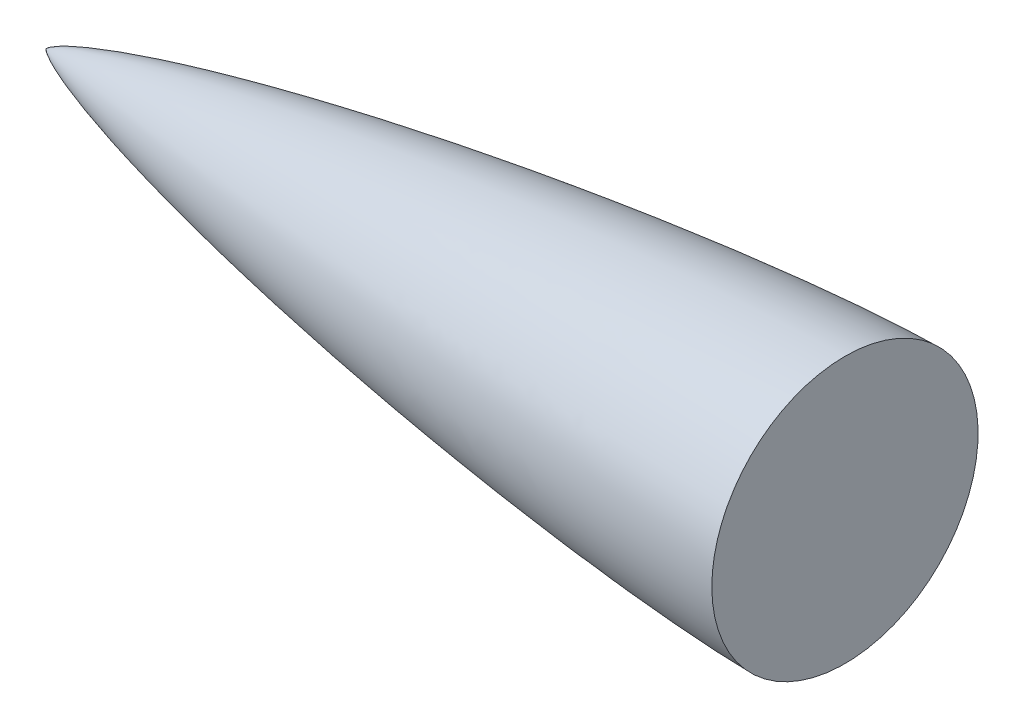
ISO-10303-21;
HEADER;
FILE_DESCRIPTION(('STEP AP214'),'2;1');
FILE_NAME('part.step','',(''),(''),'','','');
FILE_SCHEMA(('AUTOMOTIVE_DESIGN { 1 0 10303 214 1 1 1 1 }'));
ENDSEC;
DATA;
#1=APPLICATION_CONTEXT('core data for automotive mechanical design processes');
#2=APPLICATION_PROTOCOL_DEFINITION('international standard','automotive_design',2000,#1);
#3=PRODUCT_CONTEXT('',#1,'mechanical');
#4=PRODUCT('Part','Part','',(#3));
#5=PRODUCT_RELATED_PRODUCT_CATEGORY('part','',(#4));
#6=PRODUCT_DEFINITION_FORMATION('','',#4);
#7=PRODUCT_DEFINITION_CONTEXT('part definition',#1,'design');
#8=PRODUCT_DEFINITION('design','',#6,#7);
#9=PRODUCT_DEFINITION_SHAPE('','',#8);
#10=(LENGTH_UNIT() NAMED_UNIT(*) SI_UNIT(.MILLI.,.METRE.));
#11=(NAMED_UNIT(*) PLANE_ANGLE_UNIT() SI_UNIT($,.RADIAN.));
#12=(NAMED_UNIT(*) SI_UNIT($,.STERADIAN.) SOLID_ANGLE_UNIT());
#13=UNCERTAINTY_MEASURE_WITH_UNIT(LENGTH_MEASURE(1.E-05),#10,'distance_accuracy_value','');
#14=(GEOMETRIC_REPRESENTATION_CONTEXT(3) GLOBAL_UNCERTAINTY_ASSIGNED_CONTEXT((#13)) GLOBAL_UNIT_ASSIGNED_CONTEXT((#10,
#11,#12)) REPRESENTATION_CONTEXT('',''));
#15=CARTESIAN_POINT('',(0.,0.,0.));
#16=DIRECTION('',(0.,0.,1.));
#17=DIRECTION('',(1.,0.,0.));
#18=AXIS2_PLACEMENT_3D('',#15,#16,#17);
#19=CARTESIAN_POINT('',(18.,3.,0.));
#20=CARTESIAN_POINT('',(17.7903964346021,2.99838776078498,0.));
#21=CARTESIAN_POINT('',(17.2933791454022,2.98346862640083,0.));
#22=CARTESIAN_POINT('',(16.5095004006261,2.94476365080132,0.));
#23=CARTESIAN_POINT('',(15.4396526867582,2.87032528639339,0.));
#24=CARTESIAN_POINT('',(14.2934943877126,2.77179237391941,0.));
#25=CARTESIAN_POINT('',(13.1488339911408,2.65715594589926,0.));
#26=CARTESIAN_POINT('',(12.0057098215053,2.52819926008725,0.));
#27=CARTESIAN_POINT('',(10.8641949028401,2.38568467597286,0.));
#28=CARTESIAN_POINT('',(9.43944649237114,2.19115256396293,0.));
#29=CARTESIAN_POINT('',(8.01782616226952,1.97464942391305,0.));
#30=CARTESIAN_POINT('',(6.59986505072084,1.7352238457285,0.));
#31=CARTESIAN_POINT('',(5.18667606996502,1.46928194959247,0.));
#32=CARTESIAN_POINT('',(4.05973356936405,1.23813384113992,0.));
#33=CARTESIAN_POINT('',(2.958555244462,0.989370662218941,0.));
#34=CARTESIAN_POINT('',(2.0036112516684,0.747218660131184,0.));
#35=CARTESIAN_POINT('',(1.24456653321598,0.527836288076114,0.));
#36=CARTESIAN_POINT('',(0.7173195404671,0.350470877186377,0.));
#37=CARTESIAN_POINT('',(0.417857455417479,0.234406132763154,0.));
#38=CARTESIAN_POINT('',(0.239926458986436,0.154794749657574,0.));
#39=CARTESIAN_POINT('',(0.139413794598237,0.103009403544925,0.));
#40=CARTESIAN_POINT('',(0.0828931027511655,0.069703117829302,0.));
#41=CARTESIAN_POINT('',(0.0506874435171173,0.0481811317388611,0.));
#42=CARTESIAN_POINT('',(0.0317090981503373,0.0338459480971205,0.));
#43=CARTESIAN_POINT('',(0.0195269873200557,0.0236099883789213,0.));
#44=CARTESIAN_POINT('',(0.010354486533276,0.0147055471723734,0.));
#45=CARTESIAN_POINT('',(0.00432557539279316,0.00826173365113937,0.));
#46=CARTESIAN_POINT('',(0.00126341233343583,0.00309435246078076,0.));
#47=CARTESIAN_POINT('',(0.,0.,0.));
#48=B_SPLINE_CURVE_WITH_KNOTS('',4,(#19,#20,#21,#22,#23,#24,#25,#26,#27,#28,#29,#30,#31,#32,#33,
#34,#35,#36,#37,#38,#39,#40,#41,#42,#43,#44,#45,#46,#47),.UNSPECIFIED.,.F.,.F.,(5,1,1,1,1,1,1,1,
1,1,1,1,1,1,1,1,1,1,1,1,1,1,1,1,1,5),(0.,0.0457373882666249,0.108491548743318,0.171245708603946,
0.233999868048242,0.296754027664547,0.359508188661664,0.422262348720722,0.485016507721626,
0.610524830880774,0.673278988442157,0.736033148931394,0.798787304474867,0.861541461273297,
0.919598658983199,0.950975736589562,0.971149297477305,0.982891359625845,0.989653835067879,
0.993492483448471,0.995808673756379,0.997200859900925,0.998099674814109,0.998683073502927,
0.999273489930262,1.),.UNSPECIFIED.);
#49=CARTESIAN_POINT('',(0.,0.,0.));
#50=DIRECTION('',(-1.,0.,0.));
#51=AXIS1_PLACEMENT('',#49,#50);
#52=SURFACE_OF_REVOLUTION('',#48,#51);
#53=CARTESIAN_POINT('',(0.,0.,0.));
#54=VERTEX_POINT('',#53);
#55=VERTEX_LOOP('',#54);
#56=FACE_BOUND('',#55,.T.);
#57=CARTESIAN_POINT('',(18.,0.,0.));
#58=DIRECTION('',(-1.,0.,0.));
#59=DIRECTION('',(0.,0.,1.));
#60=AXIS2_PLACEMENT_3D('',#57,#58,#59);
#61=CIRCLE('',#60,3.);
#62=CARTESIAN_POINT('',(18.,0.,3.));
#63=VERTEX_POINT('',#62);
#64=EDGE_CURVE('E11',#63,#63,#61,.T.);
#65=ORIENTED_EDGE('',*,*,#64,.T.);
#66=EDGE_LOOP('',(#65));
#67=FACE_BOUND('',#66,.T.);
#68=ADVANCED_FACE('F39',(#56,#67),#52,.T.);
#69=CARTESIAN_POINT('',(18.,0.,0.));
#70=DIRECTION('',(-1.,0.,0.));
#71=DIRECTION('',(0.,0.,1.));
#72=AXIS2_PLACEMENT_3D('',#69,#70,#71);
#73=PLANE('',#72);
#74=ORIENTED_EDGE('',*,*,#64,.F.);
#75=EDGE_LOOP('',(#74));
#76=FACE_BOUND('',#75,.T.);
#77=ADVANCED_FACE('F50',(#76),#73,.F.);
#78=CLOSED_SHELL('',(#68,#77));
#79=MANIFOLD_SOLID_BREP('B2',#78);
#80=ADVANCED_BREP_SHAPE_REPRESENTATION('',(#18,#79),#14);
#81=SHAPE_DEFINITION_REPRESENTATION(#9,#80);
ENDSEC;
END-ISO-10303-21;
